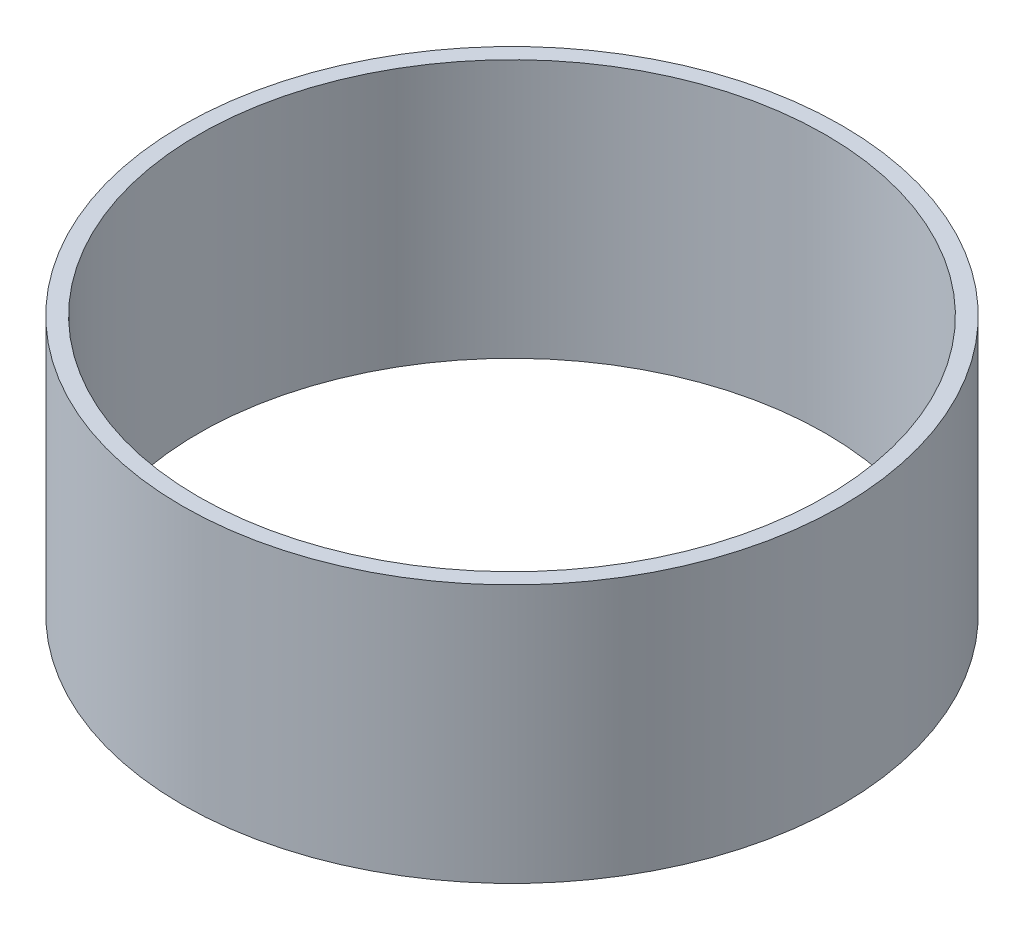
ISO-10303-21;
HEADER;
FILE_DESCRIPTION(('STEP AP214'),'2;1');
FILE_NAME('part.step','',(''),(''),'','','');
FILE_SCHEMA(('AUTOMOTIVE_DESIGN { 1 0 10303 214 1 1 1 1 }'));
ENDSEC;
DATA;
#1=APPLICATION_CONTEXT('core data for automotive mechanical design processes');
#2=APPLICATION_PROTOCOL_DEFINITION('international standard','automotive_design',2000,#1);
#3=PRODUCT_CONTEXT('',#1,'mechanical');
#4=PRODUCT('Part','Part','',(#3));
#5=PRODUCT_RELATED_PRODUCT_CATEGORY('part','',(#4));
#6=PRODUCT_DEFINITION_FORMATION('','',#4);
#7=PRODUCT_DEFINITION_CONTEXT('part definition',#1,'design');
#8=PRODUCT_DEFINITION('design','',#6,#7);
#9=PRODUCT_DEFINITION_SHAPE('','',#8);
#10=(LENGTH_UNIT() NAMED_UNIT(*) SI_UNIT(.MILLI.,.METRE.));
#11=(NAMED_UNIT(*) PLANE_ANGLE_UNIT() SI_UNIT($,.RADIAN.));
#12=(NAMED_UNIT(*) SI_UNIT($,.STERADIAN.) SOLID_ANGLE_UNIT());
#13=UNCERTAINTY_MEASURE_WITH_UNIT(LENGTH_MEASURE(1.E-05),#10,'distance_accuracy_value','');
#14=(GEOMETRIC_REPRESENTATION_CONTEXT(3) GLOBAL_UNCERTAINTY_ASSIGNED_CONTEXT((#13)) GLOBAL_UNIT_ASSIGNED_CONTEXT((#10,
#11,#12)) REPRESENTATION_CONTEXT('',''));
#15=CARTESIAN_POINT('',(0.,0.,0.));
#16=DIRECTION('',(0.,0.,1.));
#17=DIRECTION('',(1.,0.,0.));
#18=AXIS2_PLACEMENT_3D('',#15,#16,#17);
#19=CARTESIAN_POINT('',(0.,20.,0.));
#20=DIRECTION('',(0.,1.,0.));
#21=DIRECTION('',(0.,0.,1.));
#22=AXIS2_PLACEMENT_3D('',#19,#20,#21);
#23=PLANE('',#22);
#24=CARTESIAN_POINT('',(0.,20.,0.));
#25=DIRECTION('',(0.,1.,0.));
#26=DIRECTION('',(0.,0.,1.));
#27=AXIS2_PLACEMENT_3D('',#24,#25,#26);
#28=CIRCLE('',#27,51.);
#29=CARTESIAN_POINT('',(0.,20.,51.));
#30=VERTEX_POINT('',#29);
#31=EDGE_CURVE('E10',#30,#30,#28,.T.);
#32=ORIENTED_EDGE('',*,*,#31,.T.);
#33=EDGE_LOOP('',(#32));
#34=FACE_BOUND('',#33,.T.);
#35=CARTESIAN_POINT('',(0.,20.,0.));
#36=DIRECTION('',(0.,1.,0.));
#37=DIRECTION('',(0.,0.,1.));
#38=AXIS2_PLACEMENT_3D('',#35,#36,#37);
#39=CIRCLE('',#38,48.5);
#40=CARTESIAN_POINT('',(0.,20.,48.5));
#41=VERTEX_POINT('',#40);
#42=EDGE_CURVE('E45',#41,#41,#39,.T.);
#43=ORIENTED_EDGE('',*,*,#42,.F.);
#44=EDGE_LOOP('',(#43));
#45=FACE_BOUND('',#44,.T.);
#46=ADVANCED_FACE('F34',(#34,#45),#23,.T.);
#47=CARTESIAN_POINT('',(0.,-20.,0.));
#48=DIRECTION('',(0.,1.,0.));
#49=DIRECTION('',(0.,0.,1.));
#50=AXIS2_PLACEMENT_3D('',#47,#48,#49);
#51=PLANE('',#50);
#52=CARTESIAN_POINT('',(0.,-20.,0.));
#53=DIRECTION('',(0.,1.,0.));
#54=DIRECTION('',(0.,0.,1.));
#55=AXIS2_PLACEMENT_3D('',#52,#53,#54);
#56=CIRCLE('',#55,51.);
#57=CARTESIAN_POINT('',(0.,-20.,51.));
#58=VERTEX_POINT('',#57);
#59=EDGE_CURVE('E38',#58,#58,#56,.T.);
#60=ORIENTED_EDGE('',*,*,#59,.F.);
#61=EDGE_LOOP('',(#60));
#62=FACE_BOUND('',#61,.T.);
#63=CARTESIAN_POINT('',(0.,-20.,0.));
#64=DIRECTION('',(0.,1.,0.));
#65=DIRECTION('',(0.,0.,1.));
#66=AXIS2_PLACEMENT_3D('',#63,#64,#65);
#67=CIRCLE('',#66,48.5);
#68=CARTESIAN_POINT('',(0.,-20.,48.5));
#69=VERTEX_POINT('',#68);
#70=EDGE_CURVE('E47',#69,#69,#67,.T.);
#71=ORIENTED_EDGE('',*,*,#70,.T.);
#72=EDGE_LOOP('',(#71));
#73=FACE_BOUND('',#72,.T.);
#74=ADVANCED_FACE('F57',(#62,#73),#51,.F.);
#75=CARTESIAN_POINT('',(0.,20.,0.));
#76=DIRECTION('',(0.,-1.,0.));
#77=DIRECTION('',(0.,0.,-1.));
#78=AXIS2_PLACEMENT_3D('',#75,#76,#77);
#79=CYLINDRICAL_SURFACE('',#78,51.);
#80=ORIENTED_EDGE('',*,*,#31,.F.);
#81=EDGE_LOOP('',(#80));
#82=FACE_BOUND('',#81,.T.);
#83=ORIENTED_EDGE('',*,*,#59,.T.);
#84=EDGE_LOOP('',(#83));
#85=FACE_BOUND('',#84,.T.);
#86=ADVANCED_FACE('F36',(#82,#85),#79,.T.);
#87=CARTESIAN_POINT('',(0.,20.,0.));
#88=DIRECTION('',(0.,-1.,0.));
#89=DIRECTION('',(0.,0.,-1.));
#90=AXIS2_PLACEMENT_3D('',#87,#88,#89);
#91=CYLINDRICAL_SURFACE('',#90,48.5);
#92=ORIENTED_EDGE('',*,*,#42,.T.);
#93=EDGE_LOOP('',(#92));
#94=FACE_BOUND('',#93,.T.);
#95=ORIENTED_EDGE('',*,*,#70,.F.);
#96=EDGE_LOOP('',(#95));
#97=FACE_BOUND('',#96,.T.);
#98=ADVANCED_FACE('F53',(#94,#97),#91,.F.);
#99=CLOSED_SHELL('',(#46,#74,#86,#98));
#100=MANIFOLD_SOLID_BREP('B2',#99);
#101=ADVANCED_BREP_SHAPE_REPRESENTATION('',(#18,#100),#14);
#102=SHAPE_DEFINITION_REPRESENTATION(#9,#101);
ENDSEC;
END-ISO-10303-21;
